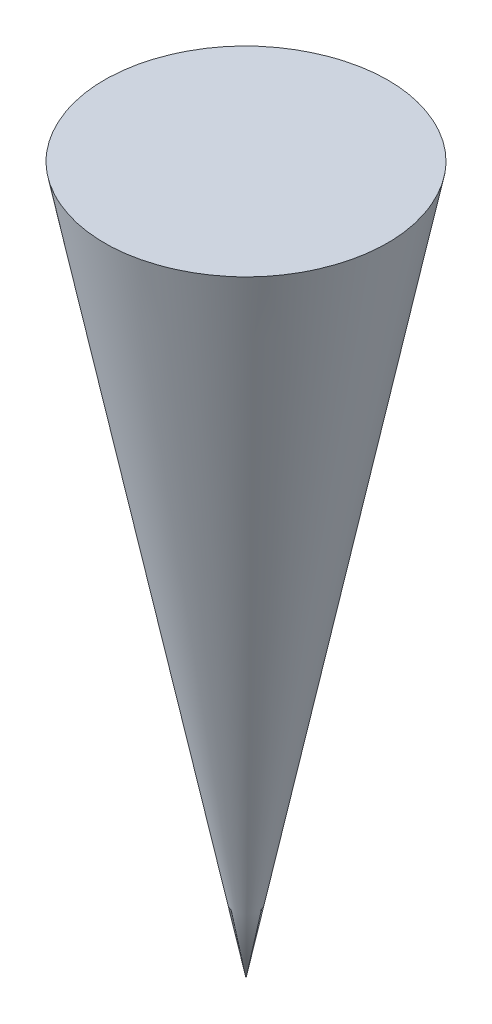
ISO-10303-21;
HEADER;
FILE_DESCRIPTION(('STEP AP214'),'2;1');
FILE_NAME('part.step','',(''),(''),'','','');
FILE_SCHEMA(('AUTOMOTIVE_DESIGN { 1 0 10303 214 1 1 1 1 }'));
ENDSEC;
DATA;
#1=APPLICATION_CONTEXT('core data for automotive mechanical design processes');
#2=APPLICATION_PROTOCOL_DEFINITION('international standard','automotive_design',2000,#1);
#3=PRODUCT_CONTEXT('',#1,'mechanical');
#4=PRODUCT('Part','Part','',(#3));
#5=PRODUCT_RELATED_PRODUCT_CATEGORY('part','',(#4));
#6=PRODUCT_DEFINITION_FORMATION('','',#4);
#7=PRODUCT_DEFINITION_CONTEXT('part definition',#1,'design');
#8=PRODUCT_DEFINITION('design','',#6,#7);
#9=PRODUCT_DEFINITION_SHAPE('','',#8);
#10=(LENGTH_UNIT() NAMED_UNIT(*) SI_UNIT(.MILLI.,.METRE.));
#11=(NAMED_UNIT(*) PLANE_ANGLE_UNIT() SI_UNIT($,.RADIAN.));
#12=(NAMED_UNIT(*) SI_UNIT($,.STERADIAN.) SOLID_ANGLE_UNIT());
#13=UNCERTAINTY_MEASURE_WITH_UNIT(LENGTH_MEASURE(1.E-05),#10,'distance_accuracy_value','');
#14=(GEOMETRIC_REPRESENTATION_CONTEXT(3) GLOBAL_UNCERTAINTY_ASSIGNED_CONTEXT((#13)) GLOBAL_UNIT_ASSIGNED_CONTEXT((#10,
#11,#12)) REPRESENTATION_CONTEXT('',''));
#15=CARTESIAN_POINT('',(0.,0.,0.));
#16=DIRECTION('',(0.,0.,1.));
#17=DIRECTION('',(1.,0.,0.));
#18=AXIS2_PLACEMENT_3D('',#15,#16,#17);
#19=CARTESIAN_POINT('',(8.802554399905,-1.85,-18.16644269139));
#20=DIRECTION('',(0.,1.,0.));
#21=DIRECTION('',(0.,0.,-1.));
#22=AXIS2_PLACEMENT_3D('',#19,#20,#21);
#23=CONICAL_SURFACE('',#22,0.25,0.19739555985);
#24=CARTESIAN_POINT('',(8.802554399905,-1.85,-18.41644269139));
#25=CARTESIAN_POINT('',(8.79850450876799,-1.85,-18.4164292078639));
#26=CARTESIAN_POINT('',(8.79445492674407,-1.85,-18.4163149053924));
#27=CARTESIAN_POINT('',(8.78637324913586,-1.85,-18.4158851221698));
#28=CARTESIAN_POINT('',(8.78234113563356,-1.85,-18.4155699781917));
#29=CARTESIAN_POINT('',(8.77429439293657,-1.85,-18.4147385887551));
#30=CARTESIAN_POINT('',(8.77027978054405,-1.85,-18.4142221806578));
#31=CARTESIAN_POINT('',(8.76226799611877,-1.85,-18.4129888857534));
#32=CARTESIAN_POINT('',(8.75827092474744,-1.85,-18.412271345734));
#33=CARTESIAN_POINT('',(8.75029413927787,-1.85,-18.4106362170065));
#34=CARTESIAN_POINT('',(8.74631465524403,-1.85,-18.4097175074876));
#35=CARTESIAN_POINT('',(8.73837286735614,-1.85,-18.4076806122382));
#36=CARTESIAN_POINT('',(8.73441096189595,-1.85,-18.4065608752361));
#37=CARTESIAN_POINT('',(8.72650430562963,-1.85,-18.4041219467381));
#38=CARTESIAN_POINT('',(8.72256015446711,-1.85,-18.4028008149591));
#39=CARTESIAN_POINT('',(8.71468823424906,-1.85,-18.3999609653762));
#40=CARTESIAN_POINT('',(8.71076127960934,-1.85,-18.3984399936914));
#41=CARTESIAN_POINT('',(8.70303565127448,-1.85,-18.3952406193054));
#42=CARTESIAN_POINT('',(8.69923595384963,-1.85,-18.3935646920338));
#43=CARTESIAN_POINT('',(8.69175285669794,-1.85,-18.3900457256959));
#44=CARTESIAN_POINT('',(8.688068756047,-1.85,-18.3882041796786));
#45=CARTESIAN_POINT('',(8.68081616305675,-1.85,-18.3843558883402));
#46=CARTESIAN_POINT('',(8.67724710955848,-1.85,-18.3823502008694));
#47=CARTESIAN_POINT('',(8.67022461104841,-1.85,-18.3781736766865));
#48=CARTESIAN_POINT('',(8.66677079041266,-1.85,-18.3760034719042));
#49=CARTESIAN_POINT('',(8.65997855929351,-1.85,-18.3714984090389));
#50=CARTESIAN_POINT('',(8.65664000811819,-1.85,-18.369163763074));
#51=CARTESIAN_POINT('',(8.65007792868995,-1.85,-18.3643303708731));
#52=CARTESIAN_POINT('',(8.64685453753361,-1.85,-18.3618314384855));
#53=CARTESIAN_POINT('',(8.64052306198697,-1.85,-18.3566692789061));
#54=CARTESIAN_POINT('',(8.63741542933721,-1.85,-18.3540054980751));
#55=CARTESIAN_POINT('',(8.63131300267169,-1.85,-18.3485162398786));
#56=CARTESIAN_POINT('',(8.62831898663751,-1.85,-18.3456898976989));
#57=CARTESIAN_POINT('',(8.62253674031185,-1.85,-18.3399519284407));
#58=CARTESIAN_POINT('',(8.61974551334309,-1.85,-18.3370433274214));
#59=CARTESIAN_POINT('',(8.61432098399231,-1.85,-18.3310878427222));
#60=CARTESIAN_POINT('',(8.6116875200825,-1.85,-18.3280411062918));
#61=CARTESIAN_POINT('',(8.60657596743313,-1.85,-18.3218119069691));
#62=CARTESIAN_POINT('',(8.60409813362272,-1.85,-18.3186292350316));
#63=CARTESIAN_POINT('',(8.59929798799068,-1.85,-18.3121279386819));
#64=CARTESIAN_POINT('',(8.59697637637443,-1.85,-18.3088087973668));
#65=CARTESIAN_POINT('',(8.59248810255975,-1.85,-18.3020350000924));
#66=CARTESIAN_POINT('',(8.59032259784058,-1.85,-18.2985795778215));
#67=CARTESIAN_POINT('',(8.58614600690785,-1.85,-18.2915334645918));
#68=CARTESIAN_POINT('',(8.58413653372796,-1.85,-18.2879418182808));
#69=CARTESIAN_POINT('',(8.58027198166569,-1.85,-18.2806232476697));
#70=CARTESIAN_POINT('',(8.5784189607032,-1.85,-18.2768952383294));
#71=CARTESIAN_POINT('',(8.57486522355675,-1.85,-18.2693047867595));
#72=CARTESIAN_POINT('',(8.57316695437615,-1.85,-18.2654412005163));
#73=CARTESIAN_POINT('',(8.56998944629447,-1.85,-18.2577244751769));
#74=CARTESIAN_POINT('',(8.56850619963663,-1.85,-18.2538729884733));
#75=CARTESIAN_POINT('',(8.56573949507108,-1.85,-18.2461300022314));
#76=CARTESIAN_POINT('',(8.56445467693091,-1.85,-18.2422389897218));
#77=CARTESIAN_POINT('',(8.56208277864516,-1.85,-18.234417891473));
#78=CARTESIAN_POINT('',(8.56099476357732,-1.85,-18.2304880893055));
#79=CARTESIAN_POINT('',(8.55901646975406,-1.85,-18.2225894201093));
#80=CARTESIAN_POINT('',(8.55812570367612,-1.85,-18.2186206752374));
#81=CARTESIAN_POINT('',(8.5565413874829,-1.85,-18.2106443271743));
#82=CARTESIAN_POINT('',(8.55584782300723,-1.85,-18.2066367268345));
#83=CARTESIAN_POINT('',(8.55465724896718,-1.85,-18.1985827703711));
#84=CARTESIAN_POINT('',(8.55416070716494,-1.85,-18.1945363451017));
#85=CARTESIAN_POINT('',(8.55336448440298,-1.85,-18.1864047916717));
#86=CARTESIAN_POINT('',(8.55306575271727,-1.85,-18.182319570967));
#87=CARTESIAN_POINT('',(8.55266167599983,-1.85,-18.1741104920519));
#88=CARTESIAN_POINT('',(8.55255772047202,-1.85,-18.1699865655887));
#89=CARTESIAN_POINT('',(8.55255412236838,-1.85,-18.161831087988));
#90=CARTESIAN_POINT('',(8.55264994173867,-1.85,-18.1577995431785));
#91=CARTESIAN_POINT('',(8.5530488236519,-1.85,-18.1497510545663));
#92=CARTESIAN_POINT('',(8.55335165930253,-1.85,-18.1457340996138));
#93=CARTESIAN_POINT('',(8.55416108301447,-1.85,-18.137714787703));
#94=CARTESIAN_POINT('',(8.55466797419788,-1.85,-18.1337124614403));
#95=CARTESIAN_POINT('',(8.55588576157399,-1.85,-18.1257223537925));
#96=CARTESIAN_POINT('',(8.55659747765229,-1.85,-18.1217346974278));
#97=CARTESIAN_POINT('',(8.55822422333939,-1.85,-18.1137738371993));
#98=CARTESIAN_POINT('',(8.55914055864707,-1.85,-18.1098009006392));
#99=CARTESIAN_POINT('',(8.56117600365939,-1.85,-18.1018692833457));
#100=CARTESIAN_POINT('',(8.56229686317332,-1.85,-18.0979110522911));
#101=CARTESIAN_POINT('',(8.56474136159947,-1.85,-18.0900088299218));
#102=CARTESIAN_POINT('',(8.56606714751177,-1.85,-18.0860655041924));
#103=CARTESIAN_POINT('',(8.56891941658995,-1.85,-18.0781922149158));
#104=CARTESIAN_POINT('',(8.5704483577048,-1.85,-18.0742631432965));
#105=CARTESIAN_POINT('',(8.57365557042494,-1.85,-18.0665589259874));
#106=CARTESIAN_POINT('',(8.57533021829119,-1.85,-18.0627822738581));
#107=CARTESIAN_POINT('',(8.57884809567341,-1.85,-18.0553429928607));
#108=CARTESIAN_POINT('',(8.5806899587289,-1.85,-18.0516797189221));
#109=CARTESIAN_POINT('',(8.58454013984415,-1.85,-18.0444664058932));
#110=CARTESIAN_POINT('',(8.58654753299002,-1.85,-18.0409158731847));
#111=CARTESIAN_POINT('',(8.59072877465065,-1.85,-18.0339280550962));
#112=CARTESIAN_POINT('',(8.59290212666291,-1.85,-18.0304904727732));
#113=CARTESIAN_POINT('',(8.59741477260695,-1.85,-18.0237283386398));
#114=CARTESIAN_POINT('',(8.59975398863481,-1.85,-18.0204037348362));
#115=CARTESIAN_POINT('',(8.60459782192045,-1.85,-18.0138671675219));
#116=CARTESIAN_POINT('',(8.60710275469075,-1.85,-18.0106554378094));
#117=CARTESIAN_POINT('',(8.61227819992886,-1.85,-18.0043448771847));
#118=CARTESIAN_POINT('',(8.61494938786399,-1.85,-18.0012466007002));
#119=CARTESIAN_POINT('',(8.62045483123411,-1.85,-17.9951605367741));
#120=CARTESIAN_POINT('',(8.62329006152263,-1.85,-17.9921736313332));
#121=CARTESIAN_POINT('',(8.62904296623045,-1.85,-17.9864065371281));
#122=CARTESIAN_POINT('',(8.6319575671149,-1.85,-17.9836232883385));
#123=CARTESIAN_POINT('',(8.63792369623177,-1.85,-17.9782136417219));
#124=CARTESIAN_POINT('',(8.64097508540537,-1.85,-17.9755870906574));
#125=CARTESIAN_POINT('',(8.64721231673567,-1.85,-17.9704883613745));
#126=CARTESIAN_POINT('',(8.65039836689285,-1.85,-17.9680164377741));
#127=CARTESIAN_POINT('',(8.65690513605519,-1.85,-17.9632271019942));
#128=CARTESIAN_POINT('',(8.66022636310213,-1.85,-17.9609103801507));
#129=CARTESIAN_POINT('',(8.66700306092025,-1.85,-17.9564308897528));
#130=CARTESIAN_POINT('',(8.67045928307005,-1.85,-17.954269258819));
#131=CARTESIAN_POINT('',(8.67750572905071,-1.85,-17.9500994274186));
#132=CARTESIAN_POINT('',(8.68109688902986,-1.85,-17.9480928101725));
#133=CARTESIAN_POINT('',(8.68841322551292,-1.85,-17.9442329946095));
#134=CARTESIAN_POINT('',(8.69213946543876,-1.85,-17.9423818150217));
#135=CARTESIAN_POINT('',(8.69972511327131,-1.85,-17.9388307847851));
#136=CARTESIAN_POINT('',(8.70358564292605,-1.85,-17.9371333337728));
#137=CARTESIAN_POINT('',(8.71130243165791,-1.85,-17.9339535136791));
#138=CARTESIAN_POINT('',(8.71515717203974,-1.85,-17.9324674640826));
#139=CARTESIAN_POINT('',(8.72290546995608,-1.85,-17.9296951588328));
#140=CARTESIAN_POINT('',(8.72679852152312,-1.85,-17.9284074919746));
#141=CARTESIAN_POINT('',(8.73462249746728,-1.85,-17.9260298948626));
#142=CARTESIAN_POINT('',(8.73855312057647,-1.85,-17.924938973407));
#143=CARTESIAN_POINT('',(8.74645223103954,-1.85,-17.9229548741435));
#144=CARTESIAN_POINT('',(8.75042058047485,-1.85,-17.9220611477459));
#145=CARTESIAN_POINT('',(8.75839493452967,-1.85,-17.9204709222291));
#146=CARTESIAN_POINT('',(8.76240092337652,-1.85,-17.9197743439978));
#147=CARTESIAN_POINT('',(8.77045045050546,-1.85,-17.9185777556753));
#148=CARTESIAN_POINT('',(8.77449404842048,-1.85,-17.9180781467003));
#149=CARTESIAN_POINT('',(8.78261873784842,-1.85,-17.9172758084928));
#150=CARTESIAN_POINT('',(8.78669991610357,-1.85,-17.916973961338));
#151=CARTESIAN_POINT('',(8.79489969439253,-1.85,-17.9165636574123));
#152=CARTESIAN_POINT('',(8.79901836058888,-1.85,-17.916456525173));
#153=CARTESIAN_POINT('',(8.80716692618239,-1.85,-17.9164467201925));
#154=CARTESIAN_POINT('',(8.81119681605208,-1.85,-17.9165396692963));
#155=CARTESIAN_POINT('',(8.81924231506777,-1.85,-17.916933264009));
#156=CARTESIAN_POINT('',(8.82325793472178,-1.85,-17.9172336929912));
#157=CARTESIAN_POINT('',(8.83127489538341,-1.85,-17.9180387370967));
#158=CARTESIAN_POINT('',(8.83527620446359,-1.85,-17.9185436691113));
#159=CARTESIAN_POINT('',(8.84326459807823,-1.85,-17.9197579725959));
#160=CARTESIAN_POINT('',(8.84725155532355,-1.85,-17.9204681810237));
#161=CARTESIAN_POINT('',(8.85521133871984,-1.85,-17.9220923415372));
#162=CARTESIAN_POINT('',(8.85918389391602,-1.85,-17.9230076190476));
#163=CARTESIAN_POINT('',(8.86711507126067,-1.85,-17.9250413767147));
#164=CARTESIAN_POINT('',(8.8710732384883,-1.85,-17.9261616284096));
#165=CARTESIAN_POINT('',(8.87897565794318,-1.85,-17.9286053366596));
#166=CARTESIAN_POINT('',(8.88291923765983,-1.85,-17.9299309632685));
#167=CARTESIAN_POINT('',(8.89079336013709,-1.85,-17.9327833414989));
#168=CARTESIAN_POINT('',(8.89472300248559,-1.85,-17.9343125745768));
#169=CARTESIAN_POINT('',(8.90242728286837,-1.85,-17.9375201934975));
#170=CARTESIAN_POINT('',(8.90620344779556,-1.85,-17.939194906923));
#171=CARTESIAN_POINT('',(8.91364200198275,-1.85,-17.9427131308101));
#172=CARTESIAN_POINT('',(8.91730502993029,-1.85,-17.9445552886068));
#173=CARTESIAN_POINT('',(8.92451809808551,-1.85,-17.9484062770737));
#174=CARTESIAN_POINT('',(8.92806862439364,-1.85,-17.9504141971459));
#175=CARTESIAN_POINT('',(8.93505667838047,-1.85,-17.9545967091411));
#176=CARTESIAN_POINT('',(8.93849449431748,-1.85,-17.956770819217));
#177=CARTESIAN_POINT('',(8.94525734546221,-1.85,-17.9612851977428));
#178=CARTESIAN_POINT('',(8.94858242296145,-1.85,-17.9636254028432));
#179=CARTESIAN_POINT('',(8.95512018819152,-1.85,-17.9684714311879));
#180=CARTESIAN_POINT('',(8.95833263162719,-1.85,-17.9709775840187));
#181=CARTESIAN_POINT('',(8.96464487179979,-1.85,-17.976155685985));
#182=CARTESIAN_POINT('',(8.96774410303359,-1.85,-17.9788283239064));
#183=CARTESIAN_POINT('',(8.97383232606769,-1.85,-17.9843368880211));
#184=CARTESIAN_POINT('',(8.97682042472907,-1.85,-17.9871738011605));
#185=CARTESIAN_POINT('',(8.98258970466014,-1.85,-17.9929298086832));
#186=CARTESIAN_POINT('',(8.9853739548055,-1.85,-17.9958458211579));
#187=CARTESIAN_POINT('',(8.99078551637054,-1.85,-18.0018145996509));
#188=CARTESIAN_POINT('',(8.99341298776269,-1.85,-18.0048672205111));
#189=CARTESIAN_POINT('',(8.99851346604846,-1.85,-18.0111067446323));
#190=CARTESIAN_POINT('',(9.00098622588035,-1.85,-18.0142938497172));
#191=CARTESIAN_POINT('',(9.00577714242926,-1.85,-18.0208025574283));
#192=CARTESIAN_POINT('',(9.00809461716801,-1.85,-18.0241246619642));
#193=CARTESIAN_POINT('',(9.01257552067414,-1.85,-18.030902943551));
#194=CARTESIAN_POINT('',(9.01473782075157,-1.85,-18.034359866147));
#195=CARTESIAN_POINT('',(9.01890889748675,-1.85,-18.0414075412773));
#196=CARTESIAN_POINT('',(9.02091610020556,-1.85,-18.0449992245926));
#197=CARTESIAN_POINT('',(9.0247769928634,-1.85,-18.0523164358559));
#198=CARTESIAN_POINT('',(9.02662867348135,-1.85,-18.0560430224452));
#199=CARTESIAN_POINT('',(9.03018061408834,-1.85,-18.0636291897316));
#200=CARTESIAN_POINT('',(9.0318784836627,-1.85,-18.0674898880806));
#201=CARTESIAN_POINT('',(9.03505936142958,-1.85,-18.075207649503));
#202=CARTESIAN_POINT('',(9.03654602254914,-1.85,-18.0790632049266));
#203=CARTESIAN_POINT('',(9.03931922872707,-1.85,-18.0868127520619));
#204=CARTESIAN_POINT('',(9.04060720764541,-1.85,-18.0907062295909));
#205=CARTESIAN_POINT('',(9.04298510887888,-1.85,-18.0985306742417));
#206=CARTESIAN_POINT('',(9.04407604484117,-1.85,-18.1024613332469));
#207=CARTESIAN_POINT('',(9.04605985293093,-1.85,-18.1103601311971));
#208=CARTESIAN_POINT('',(9.04695329555693,-1.85,-18.1143281267277));
#209=CARTESIAN_POINT('',(9.04854263354301,-1.85,-18.1223013871341));
#210=CARTESIAN_POINT('',(9.04923862874266,-1.85,-18.1263066321127));
#211=CARTESIAN_POINT('',(9.05043373509882,-1.85,-18.1343542843735));
#212=CARTESIAN_POINT('',(9.05093246412936,-1.85,-18.1383967484107));
#213=CARTESIAN_POINT('',(9.05173271838813,-1.85,-18.14651878132));
#214=CARTESIAN_POINT('',(9.05203337837448,-1.85,-18.1505984350847));
#215=CARTESIAN_POINT('',(9.05244102373236,-1.85,-18.1587947760226));
#216=CARTESIAN_POINT('',(9.05254669884818,-1.85,-18.1629115282607));
#217=CARTESIAN_POINT('',(9.05255321673955,-1.85,-18.1710529969684));
#218=CARTESIAN_POINT('',(9.05245860351373,-1.85,-18.1750777053565));
#219=CARTESIAN_POINT('',(9.05206158294701,-1.85,-18.1831137088125));
#220=CARTESIAN_POINT('',(9.05175934231744,-1.85,-18.1871250120492));
#221=CARTESIAN_POINT('',(9.05095061328824,-1.85,-18.1951342117797));
#222=CARTESIAN_POINT('',(9.05044375756562,-1.85,-18.1991320710548));
#223=CARTESIAN_POINT('',(9.04922553632348,-1.85,-18.2071144395089));
#224=CARTESIAN_POINT('',(9.04851328333803,-1.85,-18.2110988131703));
#225=CARTESIAN_POINT('',(9.0468849656931,-1.85,-18.2190543070289));
#226=CARTESIAN_POINT('',(9.04596752662773,-1.85,-18.2230251453715));
#227=CARTESIAN_POINT('',(9.04392937368757,-1.85,-18.2309537687758));
#228=CARTESIAN_POINT('',(9.04280684193179,-1.85,-18.2349110858363));
#229=CARTESIAN_POINT('',(9.04035850391083,-1.85,-18.2428126884093));
#230=CARTESIAN_POINT('',(9.03903048479976,-1.85,-18.2467562867583));
#231=CARTESIAN_POINT('',(9.03617322804092,-1.85,-18.2546313254889));
#232=CARTESIAN_POINT('',(9.03464147054757,-1.85,-18.2585618500557));
#233=CARTESIAN_POINT('',(9.03143182682527,-1.85,-18.2662616519339));
#234=CARTESIAN_POINT('',(9.02975789262509,-1.85,-18.2700325745383));
#235=CARTESIAN_POINT('',(9.02624190571792,-1.85,-18.2774620986189));
#236=CARTESIAN_POINT('',(9.02440115223791,-1.85,-18.281121313925));
#237=CARTESIAN_POINT('',(9.02055362345191,-1.85,-18.2883282035029));
#238=CARTESIAN_POINT('',(9.01854771262109,-1.85,-18.2918763392464));
#239=CARTESIAN_POINT('',(9.01436986800542,-1.85,-18.2988610603796));
#240=CARTESIAN_POINT('',(9.01219837747647,-1.85,-18.3022979107782));
#241=CARTESIAN_POINT('',(9.00768987874419,-1.85,-18.3090602781943));
#242=CARTESIAN_POINT('',(9.00535290348274,-1.85,-18.3123858171768));
#243=CARTESIAN_POINT('',(9.00051396253802,-1.85,-18.318925944183));
#244=CARTESIAN_POINT('',(8.99801164511903,-1.85,-18.322140271964));
#245=CARTESIAN_POINT('',(8.99284185128043,-1.85,-18.3284577349584));
#246=CARTESIAN_POINT('',(8.99017367182864,-1.85,-18.3315602943808));
#247=CARTESIAN_POINT('',(8.98467458647299,-1.85,-18.33765654692));
#248=CARTESIAN_POINT('',(8.98184268631379,-1.85,-18.3406493429831));
#249=CARTESIAN_POINT('',(8.97609519906722,-1.85,-18.3464316604327));
#250=CARTESIAN_POINT('',(8.97318256270665,-1.85,-18.3492241091812));
#251=CARTESIAN_POINT('',(8.96722344032969,-1.85,-18.3546509676185));
#252=CARTESIAN_POINT('',(8.9641772146708,-1.85,-18.3572856629462));
#253=CARTESIAN_POINT('',(8.95795332142682,-1.85,-18.3623994014959));
#254=CARTESIAN_POINT('',(8.95477556381297,-1.85,-18.3648783350816));
#255=CARTESIAN_POINT('',(8.94828841153942,-1.85,-18.3696804177837));
#256=CARTESIAN_POINT('',(8.94497862180976,-1.85,-18.3720030331546));
#257=CARTESIAN_POINT('',(8.93822783430123,-1.85,-18.37649302704));
#258=CARTESIAN_POINT('',(8.93478618914372,-1.85,-18.378659431531));
#259=CARTESIAN_POINT('',(8.92777193683336,-1.85,-18.3828375030804));
#260=CARTESIAN_POINT('',(8.92419848621319,-1.85,-18.38484775308));
#261=CARTESIAN_POINT('',(8.91692064865183,-1.85,-18.3887135991387));
#262=CARTESIAN_POINT('',(8.91321527872283,-1.85,-18.39056734218));
#263=CARTESIAN_POINT('',(8.90567435496644,-1.85,-18.3941219858526));
#264=CARTESIAN_POINT('',(8.90183774465178,-1.85,-18.3958206420003));
#265=CARTESIAN_POINT('',(8.8941353759929,-1.85,-18.3990173182674));
#266=CARTESIAN_POINT('',(8.89027051256409,-1.85,-18.4005174917177));
#267=CARTESIAN_POINT('',(8.88250769653386,-1.85,-18.4033131461839));
#268=CARTESIAN_POINT('',(8.87861038145094,-1.85,-18.4046103935252));
#269=CARTESIAN_POINT('',(8.87078352034658,-1.85,-18.4070019803141));
#270=CARTESIAN_POINT('',(8.86685438583991,-1.85,-18.4080976657264));
#271=CARTESIAN_POINT('',(8.85896394462292,-1.85,-18.4100861837509));
#272=CARTESIAN_POINT('',(8.85500286359798,-1.85,-18.4109799108531));
#273=CARTESIAN_POINT('',(8.84704875722975,-1.85,-18.4125650714297));
#274=CARTESIAN_POINT('',(8.84305581283057,-1.85,-18.4132569109415));
#275=CARTESIAN_POINT('',(8.83503810061703,-1.85,-18.4144387978877));
#276=CARTESIAN_POINT('',(8.83101331771761,-1.85,-18.4149287430034));
#277=CARTESIAN_POINT('',(8.8229320424627,-1.85,-18.4157072527474));
#278=CARTESIAN_POINT('',(8.81887549093223,-1.85,-18.4159952013931));
#279=CARTESIAN_POINT('',(8.81073062502436,-1.85,-18.4163706399257));
#280=CARTESIAN_POINT('',(8.80664225901456,-1.85,-18.416457013043));
#281=CARTESIAN_POINT('',(8.802554399905,-1.85,-18.41644269139));
#282=B_SPLINE_CURVE_WITH_KNOTS('',3,(#24,#25,#26,#27,#28,#29,#30,#31,#32,#33,#34,#35,#36,#37,
#38,#39,#40,#41,#42,#43,#44,#45,#46,#47,#48,#49,#50,#51,#52,#53,#54,#55,#56,#57,#58,#59,#60,#61,
#62,#63,#64,#65,#66,#67,#68,#69,#70,#71,#72,#73,#74,#75,#76,#77,#78,#79,#80,#81,#82,#83,#84,#85,
#86,#87,#88,#89,#90,#91,#92,#93,#94,#95,#96,#97,#98,#99,#100,#101,#102,#103,#104,#105,#106,#107,
#108,#109,#110,#111,#112,#113,#114,#115,#116,#117,#118,#119,#120,#121,#122,#123,#124,#125,#126,
#127,#128,#129,#130,#131,#132,#133,#134,#135,#136,#137,#138,#139,#140,#141,#142,#143,#144,#145,
#146,#147,#148,#149,#150,#151,#152,#153,#154,#155,#156,#157,#158,#159,#160,#161,#162,#163,#164,
#165,#166,#167,#168,#169,#170,#171,#172,#173,#174,#175,#176,#177,#178,#179,#180,#181,#182,#183,
#184,#185,#186,#187,#188,#189,#190,#191,#192,#193,#194,#195,#196,#197,#198,#199,#200,#201,#202,
#203,#204,#205,#206,#207,#208,#209,#210,#211,#212,#213,#214,#215,#216,#217,#218,#219,#220,#221,
#222,#223,#224,#225,#226,#227,#228,#229,#230,#231,#232,#233,#234,#235,#236,#237,#238,#239,#240,
#241,#242,#243,#244,#245,#246,#247,#248,#249,#250,#251,#252,#253,#254,#255,#256,#257,#258,#259,
#260,#261,#262,#263,#264,#265,#266,#267,#268,#269,#270,#271,#272,#273,#274,#275,#276,#277,#278,
#279,#280,#281),.UNSPECIFIED.,.F.,.F.,(4,2,2,2,2,2,2,2,2,2,2,2,2,2,2,2,2,2,2,2,2,2,2,2,2,2,2,2,
2,2,2,2,2,2,2,2,2,2,2,2,2,2,2,2,2,2,2,2,2,2,2,2,2,2,2,2,2,2,2,2,2,2,2,2,2,2,2,2,2,2,2,2,2,2,2,2,
2,2,2,2,2,2,2,2,2,2,2,2,2,2,2,2,2,2,2,2,2,2,2,2,2,2,2,2,2,2,2,2,2,2,2,2,2,2,2,2,2,2,2,2,2,2,2,2,
2,2,2,2,4),(0.,0.0121485328165597,0.0242767482648527,0.0364147847578852,0.0485927077923373,
0.0608402891266542,0.0731867966178112,0.0856608018085477,0.0982900109424862,0.110744099660468,
0.123095422391778,0.135372613534408,0.147604828101455,0.159821543118099,0.172052347674779,
0.184326728968,0.196673861990735,0.208762392170013,0.22083832602223,0.232933550935606,
0.245079802365629,0.257308418505316,0.269650110138815,0.282134753620115,0.294791213003698,
0.307168260007754,0.31945628626173,0.331684309922077,0.3438817773969,0.356078356413277,
0.368303721166434,0.380587337235606,0.392958253970575,0.405051219190018,0.417130951580764,
0.429228694880421,0.441375553846262,0.453602258390288,0.465938941767797,0.478414940364548,
0.491058620868839,0.503447894200146,0.515743742923872,0.52797502131658,0.540171041959714,
0.552361371777235,0.564575619020377,0.57684321876514,0.589193224611426,0.601278285816283,
0.613351328263685,0.625443754134408,0.637586815232472,0.649811375024719,0.662147685303217,
0.674625185066833,0.687272327404336,0.699661532665261,0.71195807425979,0.724190821244798,
0.736389095624269,0.74858246809865,0.760800544959828,0.773072753705478,0.785428135052587,
0.797515909722868,0.809591082768089,0.821685039143757,0.833829018175078,0.846053875710517,
0.858389860712226,0.870866413894701,0.883511994222226,0.895900005588044,0.908195587138472,
0.92042762302961,0.932625448849656,0.944818647107107,0.957036833923084,0.969309444513741,
0.981665525149001,0.993755729281901,1.00583337818708,1.01792984616425,1.03007636168574,
1.0423037697696,1.05464230878074,1.06712140925931,1.07976952057776,1.09216166200539,
1.10445970361099,1.11669255716119,1.12888959799514,1.14108046033978,1.15329482339251,
1.16556219578185,1.17791170615149,1.18998404573623,1.20204670332806,1.21413111267035,
1.22626853850831,1.23848983871071,1.25082524170973,1.26330414677008,1.27595495274075,
1.28832768831456,1.30061121166603,1.31283409400178,1.32502533288805,1.33721415173531,
1.34942979132241,1.3617013007028,1.37405733488637,1.38615729385537,1.39823463648022,
1.41032038691195,1.42244550476333,1.43464064982663,1.44693595804205,1.45936083654858,
1.47194378407628,1.484376498822,1.49669412107973,1.50892624144365,1.52110307385149,
1.53325524463521,1.54541356649322,1.55760880549976,1.56987144986499),.UNSPECIFIED.);
#283=CARTESIAN_POINT('',(8.802554399905,-1.85,-18.41644269139));
#284=VERTEX_POINT('',#283);
#285=EDGE_CURVE('E11',#284,#284,#282,.T.);
#286=ORIENTED_EDGE('',*,*,#285,.F.);
#287=EDGE_LOOP('',(#286));
#288=FACE_BOUND('',#287,.T.);
#289=CARTESIAN_POINT('',(8.802554399905,-3.09999999999922,-18.16644269139));
#290=VERTEX_POINT('',#289);
#291=VERTEX_LOOP('',#290);
#292=FACE_BOUND('',#291,.T.);
#293=ADVANCED_FACE('F17',(#288,#292),#23,.T.);
#294=CARTESIAN_POINT('',(8.549554399905,-1.85,-17.91344269139));
#295=DIRECTION('',(0.,1.,0.));
#296=DIRECTION('',(1.,0.,0.));
#297=AXIS2_PLACEMENT_3D('',#294,#295,#296);
#298=PLANE('',#297);
#299=ORIENTED_EDGE('',*,*,#285,.T.);
#300=EDGE_LOOP('',(#299));
#301=FACE_BOUND('',#300,.T.);
#302=ADVANCED_FACE('F42',(#301),#298,.T.);
#303=CLOSED_SHELL('',(#293,#302));
#304=MANIFOLD_SOLID_BREP('B1',#303);
#305=ADVANCED_BREP_SHAPE_REPRESENTATION('',(#18,#304),#14);
#306=SHAPE_DEFINITION_REPRESENTATION(#9,#305);
ENDSEC;
END-ISO-10303-21;
